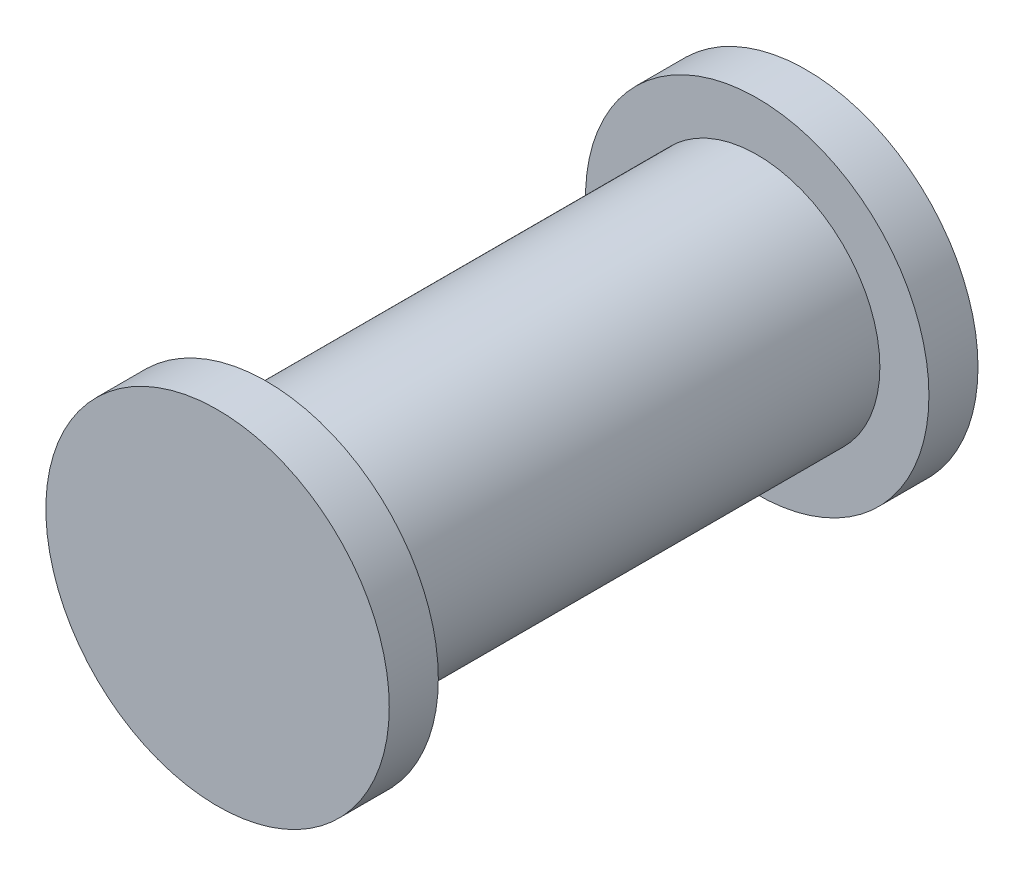
ISO-10303-21;
HEADER;
FILE_DESCRIPTION(('STEP AP214'),'2;1');
FILE_NAME('part.step','',(''),(''),'','','');
FILE_SCHEMA(('AUTOMOTIVE_DESIGN { 1 0 10303 214 1 1 1 1 }'));
ENDSEC;
DATA;
#1=APPLICATION_CONTEXT('core data for automotive mechanical design processes');
#2=APPLICATION_PROTOCOL_DEFINITION('international standard','automotive_design',2000,#1);
#3=PRODUCT_CONTEXT('',#1,'mechanical');
#4=PRODUCT('Part','Part','',(#3));
#5=PRODUCT_RELATED_PRODUCT_CATEGORY('part','',(#4));
#6=PRODUCT_DEFINITION_FORMATION('','',#4);
#7=PRODUCT_DEFINITION_CONTEXT('part definition',#1,'design');
#8=PRODUCT_DEFINITION('design','',#6,#7);
#9=PRODUCT_DEFINITION_SHAPE('','',#8);
#10=(LENGTH_UNIT() NAMED_UNIT(*) SI_UNIT(.MILLI.,.METRE.));
#11=(NAMED_UNIT(*) PLANE_ANGLE_UNIT() SI_UNIT($,.RADIAN.));
#12=(NAMED_UNIT(*) SI_UNIT($,.STERADIAN.) SOLID_ANGLE_UNIT());
#13=UNCERTAINTY_MEASURE_WITH_UNIT(LENGTH_MEASURE(1.E-05),#10,'distance_accuracy_value','');
#14=(GEOMETRIC_REPRESENTATION_CONTEXT(3) GLOBAL_UNCERTAINTY_ASSIGNED_CONTEXT((#13)) GLOBAL_UNIT_ASSIGNED_CONTEXT((#10,
#11,#12)) REPRESENTATION_CONTEXT('',''));
#15=CARTESIAN_POINT('',(0.,0.,0.));
#16=DIRECTION('',(0.,0.,1.));
#17=DIRECTION('',(1.,0.,0.));
#18=AXIS2_PLACEMENT_3D('',#15,#16,#17);
#19=CARTESIAN_POINT('',(0.,0.,100.));
#20=DIRECTION('',(0.,0.,-1.));
#21=DIRECTION('',(-1.,0.,0.));
#22=AXIS2_PLACEMENT_3D('',#19,#20,#21);
#23=CYLINDRICAL_SURFACE('',#22,25.);
#24=CARTESIAN_POINT('',(0.,0.,100.));
#25=DIRECTION('',(0.,0.,1.));
#26=DIRECTION('',(1.,0.,0.));
#27=AXIS2_PLACEMENT_3D('',#24,#25,#26);
#28=CIRCLE('',#27,25.);
#29=CARTESIAN_POINT('',(25.,0.,100.));
#30=VERTEX_POINT('',#29);
#31=EDGE_CURVE('E10',#30,#30,#28,.T.);
#32=ORIENTED_EDGE('',*,*,#31,.F.);
#33=EDGE_LOOP('',(#32));
#34=FACE_BOUND('',#33,.T.);
#35=CARTESIAN_POINT('',(0.,0.,0.));
#36=DIRECTION('',(0.,0.,1.));
#37=DIRECTION('',(1.,0.,0.));
#38=AXIS2_PLACEMENT_3D('',#35,#36,#37);
#39=CIRCLE('',#38,25.);
#40=CARTESIAN_POINT('',(25.,0.,0.));
#41=VERTEX_POINT('',#40);
#42=EDGE_CURVE('E33',#41,#41,#39,.T.);
#43=ORIENTED_EDGE('',*,*,#42,.T.);
#44=EDGE_LOOP('',(#43));
#45=FACE_BOUND('',#44,.T.);
#46=ADVANCED_FACE('F30',(#34,#45),#23,.T.);
#47=CARTESIAN_POINT('',(0.,0.,110.));
#48=DIRECTION('',(0.,0.,-1.));
#49=DIRECTION('',(-1.,0.,0.));
#50=AXIS2_PLACEMENT_3D('',#47,#48,#49);
#51=CYLINDRICAL_SURFACE('',#50,35.);
#52=CARTESIAN_POINT('',(0.,0.,110.));
#53=DIRECTION('',(0.,0.,1.));
#54=DIRECTION('',(1.,0.,0.));
#55=AXIS2_PLACEMENT_3D('',#52,#53,#54);
#56=CIRCLE('',#55,35.);
#57=CARTESIAN_POINT('',(35.,0.,110.));
#58=VERTEX_POINT('',#57);
#59=EDGE_CURVE('E37',#58,#58,#56,.T.);
#60=ORIENTED_EDGE('',*,*,#59,.F.);
#61=EDGE_LOOP('',(#60));
#62=FACE_BOUND('',#61,.T.);
#63=CARTESIAN_POINT('',(0.,0.,100.));
#64=DIRECTION('',(0.,0.,1.));
#65=DIRECTION('',(1.,0.,0.));
#66=AXIS2_PLACEMENT_3D('',#63,#64,#65);
#67=CIRCLE('',#66,35.);
#68=CARTESIAN_POINT('',(35.,0.,100.));
#69=VERTEX_POINT('',#68);
#70=EDGE_CURVE('E41',#69,#69,#67,.T.);
#71=ORIENTED_EDGE('',*,*,#70,.T.);
#72=EDGE_LOOP('',(#71));
#73=FACE_BOUND('',#72,.T.);
#74=ADVANCED_FACE('F78',(#62,#73),#51,.T.);
#75=CARTESIAN_POINT('',(0.,0.,110.));
#76=DIRECTION('',(0.,0.,1.));
#77=DIRECTION('',(1.,0.,0.));
#78=AXIS2_PLACEMENT_3D('',#75,#76,#77);
#79=PLANE('',#78);
#80=ORIENTED_EDGE('',*,*,#59,.T.);
#81=EDGE_LOOP('',(#80));
#82=FACE_BOUND('',#81,.T.);
#83=ADVANCED_FACE('F74',(#82),#79,.T.);
#84=CARTESIAN_POINT('',(0.,0.,100.));
#85=DIRECTION('',(0.,0.,1.));
#86=DIRECTION('',(1.,0.,0.));
#87=AXIS2_PLACEMENT_3D('',#84,#85,#86);
#88=PLANE('',#87);
#89=ORIENTED_EDGE('',*,*,#31,.T.);
#90=EDGE_LOOP('',(#89));
#91=FACE_BOUND('',#90,.T.);
#92=ORIENTED_EDGE('',*,*,#70,.F.);
#93=EDGE_LOOP('',(#92));
#94=FACE_BOUND('',#93,.T.);
#95=ADVANCED_FACE('F66',(#91,#94),#88,.F.);
#96=CARTESIAN_POINT('',(0.,0.,-10.));
#97=DIRECTION('',(0.,0.,1.));
#98=DIRECTION('',(1.,0.,0.));
#99=AXIS2_PLACEMENT_3D('',#96,#97,#98);
#100=CYLINDRICAL_SURFACE('',#99,35.);
#101=CARTESIAN_POINT('',(0.,0.,-10.));
#102=DIRECTION('',(0.,0.,1.));
#103=DIRECTION('',(1.,0.,0.));
#104=AXIS2_PLACEMENT_3D('',#101,#102,#103);
#105=CIRCLE('',#104,35.);
#106=CARTESIAN_POINT('',(35.,0.,-10.));
#107=VERTEX_POINT('',#106);
#108=EDGE_CURVE('E49',#107,#107,#105,.T.);
#109=ORIENTED_EDGE('',*,*,#108,.T.);
#110=EDGE_LOOP('',(#109));
#111=FACE_BOUND('',#110,.T.);
#112=CARTESIAN_POINT('',(0.,0.,0.));
#113=DIRECTION('',(0.,0.,1.));
#114=DIRECTION('',(1.,0.,0.));
#115=AXIS2_PLACEMENT_3D('',#112,#113,#114);
#116=CIRCLE('',#115,35.);
#117=CARTESIAN_POINT('',(35.,0.,0.));
#118=VERTEX_POINT('',#117);
#119=EDGE_CURVE('E46',#118,#118,#116,.T.);
#120=ORIENTED_EDGE('',*,*,#119,.F.);
#121=EDGE_LOOP('',(#120));
#122=FACE_BOUND('',#121,.T.);
#123=ADVANCED_FACE('F64',(#111,#122),#100,.T.);
#124=CARTESIAN_POINT('',(0.,0.,-10.));
#125=DIRECTION('',(0.,0.,-1.));
#126=DIRECTION('',(1.,0.,0.));
#127=AXIS2_PLACEMENT_3D('',#124,#125,#126);
#128=PLANE('',#127);
#129=ORIENTED_EDGE('',*,*,#108,.F.);
#130=EDGE_LOOP('',(#129));
#131=FACE_BOUND('',#130,.T.);
#132=ADVANCED_FACE('F60',(#131),#128,.T.);
#133=CARTESIAN_POINT('',(0.,0.,0.));
#134=DIRECTION('',(0.,0.,-1.));
#135=DIRECTION('',(1.,0.,0.));
#136=AXIS2_PLACEMENT_3D('',#133,#134,#135);
#137=PLANE('',#136);
#138=ORIENTED_EDGE('',*,*,#42,.F.);
#139=EDGE_LOOP('',(#138));
#140=FACE_BOUND('',#139,.T.);
#141=ORIENTED_EDGE('',*,*,#119,.T.);
#142=EDGE_LOOP('',(#141));
#143=FACE_BOUND('',#142,.T.);
#144=ADVANCED_FACE('F57',(#140,#143),#137,.F.);
#145=CLOSED_SHELL('',(#46,#74,#83,#95,#123,#132,#144));
#146=MANIFOLD_SOLID_BREP('B2',#145);
#147=ADVANCED_BREP_SHAPE_REPRESENTATION('',(#18,#146),#14);
#148=SHAPE_DEFINITION_REPRESENTATION(#9,#147);
ENDSEC;
END-ISO-10303-21;
